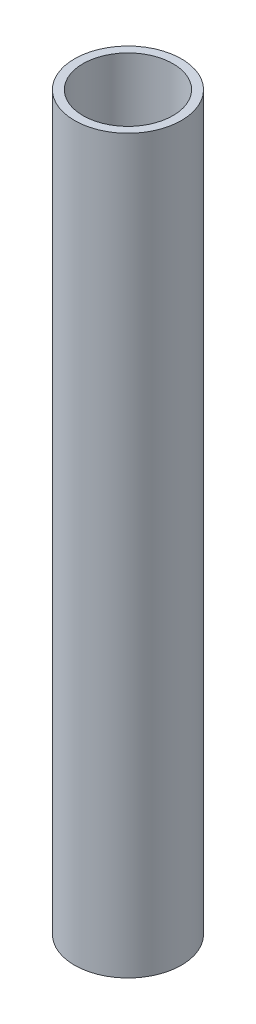
ISO-10303-21;
HEADER;
FILE_DESCRIPTION(('STEP AP214'),'2;1');
FILE_NAME('part.step','',(''),(''),'','','');
FILE_SCHEMA(('AUTOMOTIVE_DESIGN { 1 0 10303 214 1 1 1 1 }'));
ENDSEC;
DATA;
#1=APPLICATION_CONTEXT('core data for automotive mechanical design processes');
#2=APPLICATION_PROTOCOL_DEFINITION('international standard','automotive_design',2000,#1);
#3=PRODUCT_CONTEXT('',#1,'mechanical');
#4=PRODUCT('Part','Part','',(#3));
#5=PRODUCT_RELATED_PRODUCT_CATEGORY('part','',(#4));
#6=PRODUCT_DEFINITION_FORMATION('','',#4);
#7=PRODUCT_DEFINITION_CONTEXT('part definition',#1,'design');
#8=PRODUCT_DEFINITION('design','',#6,#7);
#9=PRODUCT_DEFINITION_SHAPE('','',#8);
#10=(LENGTH_UNIT() NAMED_UNIT(*) SI_UNIT(.MILLI.,.METRE.));
#11=(NAMED_UNIT(*) PLANE_ANGLE_UNIT() SI_UNIT($,.RADIAN.));
#12=(NAMED_UNIT(*) SI_UNIT($,.STERADIAN.) SOLID_ANGLE_UNIT());
#13=UNCERTAINTY_MEASURE_WITH_UNIT(LENGTH_MEASURE(1.E-05),#10,'distance_accuracy_value','');
#14=(GEOMETRIC_REPRESENTATION_CONTEXT(3) GLOBAL_UNCERTAINTY_ASSIGNED_CONTEXT((#13)) GLOBAL_UNIT_ASSIGNED_CONTEXT((#10,
#11,#12)) REPRESENTATION_CONTEXT('',''));
#15=CARTESIAN_POINT('',(0.,0.,0.));
#16=DIRECTION('',(0.,0.,1.));
#17=DIRECTION('',(1.,0.,0.));
#18=AXIS2_PLACEMENT_3D('',#15,#16,#17);
#19=CARTESIAN_POINT('',(0.,130.,0.));
#20=DIRECTION('',(0.,1.,0.));
#21=DIRECTION('',(0.,0.,1.));
#22=AXIS2_PLACEMENT_3D('',#19,#20,#21);
#23=PLANE('',#22);
#24=CARTESIAN_POINT('',(0.,130.,0.));
#25=DIRECTION('',(0.,1.,0.));
#26=DIRECTION('',(0.,0.,1.));
#27=AXIS2_PLACEMENT_3D('',#24,#25,#26);
#28=CIRCLE('',#27,9.5);
#29=CARTESIAN_POINT('',(0.,130.,9.5));
#30=VERTEX_POINT('',#29);
#31=EDGE_CURVE('E10',#30,#30,#28,.T.);
#32=ORIENTED_EDGE('',*,*,#31,.T.);
#33=EDGE_LOOP('',(#32));
#34=FACE_BOUND('',#33,.T.);
#35=CARTESIAN_POINT('',(0.,130.,0.));
#36=DIRECTION('',(0.,1.,0.));
#37=DIRECTION('',(0.,0.,1.));
#38=AXIS2_PLACEMENT_3D('',#35,#36,#37);
#39=CIRCLE('',#38,8.);
#40=CARTESIAN_POINT('',(0.,130.,8.));
#41=VERTEX_POINT('',#40);
#42=EDGE_CURVE('E45',#41,#41,#39,.T.);
#43=ORIENTED_EDGE('',*,*,#42,.F.);
#44=EDGE_LOOP('',(#43));
#45=FACE_BOUND('',#44,.T.);
#46=ADVANCED_FACE('F34',(#34,#45),#23,.T.);
#47=CARTESIAN_POINT('',(0.,0.,0.));
#48=DIRECTION('',(0.,1.,0.));
#49=DIRECTION('',(0.,0.,1.));
#50=AXIS2_PLACEMENT_3D('',#47,#48,#49);
#51=PLANE('',#50);
#52=CARTESIAN_POINT('',(0.,0.,0.));
#53=DIRECTION('',(0.,1.,0.));
#54=DIRECTION('',(0.,0.,1.));
#55=AXIS2_PLACEMENT_3D('',#52,#53,#54);
#56=CIRCLE('',#55,9.5);
#57=CARTESIAN_POINT('',(0.,0.,9.5));
#58=VERTEX_POINT('',#57);
#59=EDGE_CURVE('E38',#58,#58,#56,.T.);
#60=ORIENTED_EDGE('',*,*,#59,.F.);
#61=EDGE_LOOP('',(#60));
#62=FACE_BOUND('',#61,.T.);
#63=CARTESIAN_POINT('',(0.,0.,0.));
#64=DIRECTION('',(0.,1.,0.));
#65=DIRECTION('',(0.,0.,1.));
#66=AXIS2_PLACEMENT_3D('',#63,#64,#65);
#67=CIRCLE('',#66,8.);
#68=CARTESIAN_POINT('',(0.,0.,8.));
#69=VERTEX_POINT('',#68);
#70=EDGE_CURVE('E47',#69,#69,#67,.T.);
#71=ORIENTED_EDGE('',*,*,#70,.T.);
#72=EDGE_LOOP('',(#71));
#73=FACE_BOUND('',#72,.T.);
#74=ADVANCED_FACE('F57',(#62,#73),#51,.F.);
#75=CARTESIAN_POINT('',(0.,130.,0.));
#76=DIRECTION('',(0.,-1.,0.));
#77=DIRECTION('',(0.,0.,-1.));
#78=AXIS2_PLACEMENT_3D('',#75,#76,#77);
#79=CYLINDRICAL_SURFACE('',#78,9.5);
#80=ORIENTED_EDGE('',*,*,#31,.F.);
#81=EDGE_LOOP('',(#80));
#82=FACE_BOUND('',#81,.T.);
#83=ORIENTED_EDGE('',*,*,#59,.T.);
#84=EDGE_LOOP('',(#83));
#85=FACE_BOUND('',#84,.T.);
#86=ADVANCED_FACE('F36',(#82,#85),#79,.T.);
#87=CARTESIAN_POINT('',(0.,130.,0.));
#88=DIRECTION('',(0.,-1.,0.));
#89=DIRECTION('',(0.,0.,-1.));
#90=AXIS2_PLACEMENT_3D('',#87,#88,#89);
#91=CYLINDRICAL_SURFACE('',#90,8.);
#92=ORIENTED_EDGE('',*,*,#42,.T.);
#93=EDGE_LOOP('',(#92));
#94=FACE_BOUND('',#93,.T.);
#95=ORIENTED_EDGE('',*,*,#70,.F.);
#96=EDGE_LOOP('',(#95));
#97=FACE_BOUND('',#96,.T.);
#98=ADVANCED_FACE('F53',(#94,#97),#91,.F.);
#99=CLOSED_SHELL('',(#46,#74,#86,#98));
#100=MANIFOLD_SOLID_BREP('B2',#99);
#101=ADVANCED_BREP_SHAPE_REPRESENTATION('',(#18,#100),#14);
#102=SHAPE_DEFINITION_REPRESENTATION(#9,#101);
ENDSEC;
END-ISO-10303-21;
